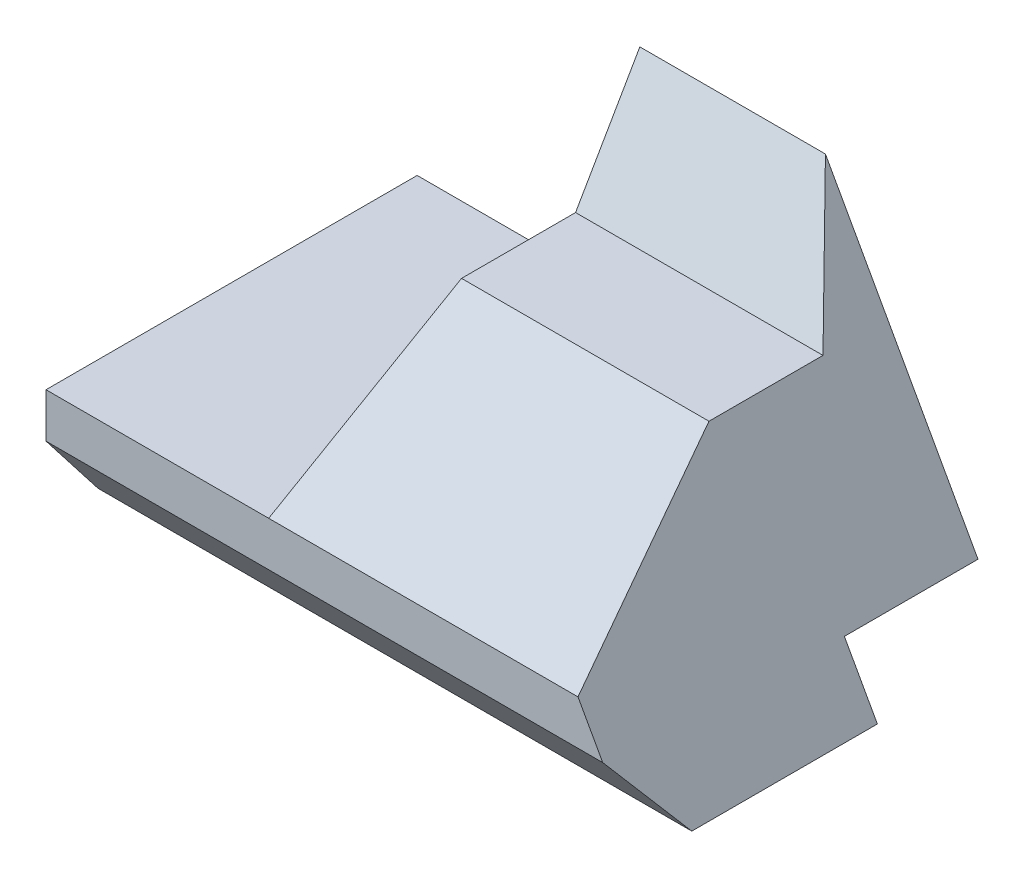
ISO-10303-21;
HEADER;
FILE_DESCRIPTION(('STEP AP214'),'2;1');
FILE_NAME('part.step','',(''),(''),'','','');
FILE_SCHEMA(('AUTOMOTIVE_DESIGN { 1 0 10303 214 1 1 1 1 }'));
ENDSEC;
DATA;
#1=APPLICATION_CONTEXT('core data for automotive mechanical design processes');
#2=APPLICATION_PROTOCOL_DEFINITION('international standard','automotive_design',2000,#1);
#3=PRODUCT_CONTEXT('',#1,'mechanical');
#4=PRODUCT('Part','Part','',(#3));
#5=PRODUCT_RELATED_PRODUCT_CATEGORY('part','',(#4));
#6=PRODUCT_DEFINITION_FORMATION('','',#4);
#7=PRODUCT_DEFINITION_CONTEXT('part definition',#1,'design');
#8=PRODUCT_DEFINITION('design','',#6,#7);
#9=PRODUCT_DEFINITION_SHAPE('','',#8);
#10=(LENGTH_UNIT() NAMED_UNIT(*) SI_UNIT(.MILLI.,.METRE.));
#11=(NAMED_UNIT(*) PLANE_ANGLE_UNIT() SI_UNIT($,.RADIAN.));
#12=(NAMED_UNIT(*) SI_UNIT($,.STERADIAN.) SOLID_ANGLE_UNIT());
#13=UNCERTAINTY_MEASURE_WITH_UNIT(LENGTH_MEASURE(1.E-05),#10,'distance_accuracy_value','');
#14=(GEOMETRIC_REPRESENTATION_CONTEXT(3) GLOBAL_UNCERTAINTY_ASSIGNED_CONTEXT((#13)) GLOBAL_UNIT_ASSIGNED_CONTEXT((#10,
#11,#12)) REPRESENTATION_CONTEXT('',''));
#15=CARTESIAN_POINT('',(0.,0.,0.));
#16=DIRECTION('',(0.,0.,1.));
#17=DIRECTION('',(1.,0.,0.));
#18=AXIS2_PLACEMENT_3D('',#15,#16,#17);
#19=CARTESIAN_POINT('',(-80.,0.999999999999993,50.));
#20=DIRECTION('',(0.,0.,1.));
#21=DIRECTION('',(0.,-1.,0.));
#22=AXIS2_PLACEMENT_3D('',#19,#20,#21);
#23=PLANE('',#22);
#24=DIRECTION('',(1.,0.,0.));
#25=VECTOR('',#24,1.);
#26=CARTESIAN_POINT('',(-80.,0.999999999999993,50.));
#27=LINE('',#26,#25);
#28=CARTESIAN_POINT('',(-80.,0.999999999999993,50.));
#29=VERTEX_POINT('',#28);
#30=CARTESIAN_POINT('',(-5.,0.999999999999994,50.));
#31=VERTEX_POINT('',#30);
#32=EDGE_CURVE('E138',#29,#31,#27,.T.);
#33=ORIENTED_EDGE('',*,*,#32,.T.);
#34=DIRECTION('',(0.485642931178632,-0.874157276121538,0.));
#35=VECTOR('',#34,1.);
#36=CARTESIAN_POINT('',(-25.,37.,50.));
#37=LINE('',#36,#35);
#38=CARTESIAN_POINT('',(-8.33333333333333,6.99999999999999,50.));
#39=VERTEX_POINT('',#38);
#40=EDGE_CURVE('E199',#39,#31,#37,.T.);
#41=ORIENTED_EDGE('',*,*,#40,.F.);
#42=DIRECTION('',(1.,0.,0.));
#43=VECTOR('',#42,1.);
#44=CARTESIAN_POINT('',(-80.,6.99999999999999,50.));
#45=LINE('',#44,#43);
#46=CARTESIAN_POINT('',(-50.,7.,50.));
#47=VERTEX_POINT('',#46);
#48=EDGE_CURVE('E146',#47,#39,#45,.T.);
#49=ORIENTED_EDGE('',*,*,#48,.F.);
#50=CARTESIAN_POINT('',(-80.,7.,50.));
#51=VERTEX_POINT('',#50);
#52=EDGE_CURVE('E142',#51,#47,#45,.T.);
#53=ORIENTED_EDGE('',*,*,#52,.F.);
#54=DIRECTION('',(0.,-1.,0.));
#55=VECTOR('',#54,1.);
#56=CARTESIAN_POINT('',(-80.,0.999999999999993,50.));
#57=LINE('',#56,#55);
#58=EDGE_CURVE('E129',#51,#29,#57,.T.);
#59=ORIENTED_EDGE('',*,*,#58,.T.);
#60=EDGE_LOOP('',(#33,#41,#49,#53,#59));
#61=FACE_BOUND('',#60,.T.);
#62=ADVANCED_FACE('F39',(#61),#23,.T.);
#63=CARTESIAN_POINT('',(-80.,6.99999999999999,50.));
#64=DIRECTION('',(0.,0.866025403784442,0.499999999999995));
#65=DIRECTION('',(0.,-0.499999999999995,0.866025403784442));
#66=AXIS2_PLACEMENT_3D('',#63,#64,#65);
#67=PLANE('',#66);
#68=ORIENTED_EDGE('',*,*,#48,.T.);
#69=DIRECTION('',(0.267643863786092,-0.481758954814966,0.834430986740811));
#70=VECTOR('',#69,1.);
#71=CARTESIAN_POINT('',(-13.3951921424459,16.1113458564026,34.2186860513782));
#72=LINE('',#71,#70);
#73=CARTESIAN_POINT('',(-16.6666666666667,22.,24.0192378864665));
#74=VERTEX_POINT('',#73);
#75=EDGE_CURVE('E202',#74,#39,#72,.T.);
#76=ORIENTED_EDGE('',*,*,#75,.F.);
#77=DIRECTION('',(1.,0.,0.));
#78=VECTOR('',#77,1.);
#79=CARTESIAN_POINT('',(-80.,22.,24.0192378864665));
#80=LINE('',#79,#78);
#81=CARTESIAN_POINT('',(-50.,22.,24.0192378864665));
#82=VERTEX_POINT('',#81);
#83=EDGE_CURVE('E147',#82,#74,#80,.T.);
#84=ORIENTED_EDGE('',*,*,#83,.F.);
#85=DIRECTION('',(0.,0.499999999999995,-0.866025403784442));
#86=VECTOR('',#85,1.);
#87=CARTESIAN_POINT('',(-50.,14.4995669872979,37.0103689432335));
#88=LINE('',#87,#86);
#89=EDGE_CURVE('E185',#47,#82,#88,.T.);
#90=ORIENTED_EDGE('',*,*,#89,.F.);
#91=EDGE_LOOP('',(#68,#76,#84,#90));
#92=FACE_BOUND('',#91,.T.);
#93=ADVANCED_FACE('F259',(#92),#67,.T.);
#94=CARTESIAN_POINT('',(-80.,22.,24.0192378864665));
#95=DIRECTION('',(0.,1.,0.));
#96=DIRECTION('',(0.,0.,1.));
#97=AXIS2_PLACEMENT_3D('',#94,#95,#96);
#98=PLANE('',#97);
#99=ORIENTED_EDGE('',*,*,#83,.T.);
#100=DIRECTION('',(0.,0.,1.));
#101=VECTOR('',#100,1.);
#102=CARTESIAN_POINT('',(-16.6666666666667,22.,50.001));
#103=LINE('',#102,#101);
#104=CARTESIAN_POINT('',(-16.6666666666667,22.,8.66025403784434));
#105=VERTEX_POINT('',#104);
#106=EDGE_CURVE('E206',#105,#74,#103,.T.);
#107=ORIENTED_EDGE('',*,*,#106,.F.);
#108=DIRECTION('',(1.,0.,0.));
#109=VECTOR('',#108,1.);
#110=CARTESIAN_POINT('',(-80.,22.,8.66025403784433));
#111=LINE('',#110,#109);
#112=CARTESIAN_POINT('',(-50.,22.,8.66025403784433));
#113=VERTEX_POINT('',#112);
#114=EDGE_CURVE('E151',#113,#105,#111,.T.);
#115=ORIENTED_EDGE('',*,*,#114,.F.);
#116=DIRECTION('',(0.,0.,-1.));
#117=VECTOR('',#116,1.);
#118=CARTESIAN_POINT('',(-50.,22.,50.001));
#119=LINE('',#118,#117);
#120=EDGE_CURVE('E189',#82,#113,#119,.T.);
#121=ORIENTED_EDGE('',*,*,#120,.F.);
#122=EDGE_LOOP('',(#99,#107,#115,#121));
#123=FACE_BOUND('',#122,.T.);
#124=ADVANCED_FACE('F256',(#123),#98,.T.);
#125=CARTESIAN_POINT('',(-80.,22.,8.66025403784433));
#126=DIRECTION('',(0.,0.499999999999998,0.86602540378444));
#127=DIRECTION('',(0.,-0.86602540378444,0.499999999999998));
#128=AXIS2_PLACEMENT_3D('',#125,#126,#127);
#129=PLANE('',#128);
#130=ORIENTED_EDGE('',*,*,#114,.T.);
#131=DIRECTION('',(0.433554984762061,-0.780398972571709,0.450563556889581));
#132=VECTOR('',#131,1.);
#133=CARTESIAN_POINT('',(-15.2326008538439,19.4186815369189,10.1505789473683));
#134=LINE('',#133,#132);
#135=CARTESIAN_POINT('',(-25.,37.,0.));
#136=VERTEX_POINT('',#135);
#137=EDGE_CURVE('E214',#136,#105,#134,.T.);
#138=ORIENTED_EDGE('',*,*,#137,.F.);
#139=DIRECTION('',(1.,0.,0.));
#140=VECTOR('',#139,1.);
#141=CARTESIAN_POINT('',(-80.,37.,0.));
#142=LINE('',#141,#140);
#143=CARTESIAN_POINT('',(-50.,37.,0.));
#144=VERTEX_POINT('',#143);
#145=EDGE_CURVE('E155',#144,#136,#142,.T.);
#146=ORIENTED_EDGE('',*,*,#145,.F.);
#147=DIRECTION('',(0.,0.86602540378444,-0.499999999999998));
#148=VECTOR('',#147,1.);
#149=CARTESIAN_POINT('',(-50.,15.3489318926872,12.5002499999999));
#150=LINE('',#149,#148);
#151=EDGE_CURVE('E193',#113,#144,#150,.T.);
#152=ORIENTED_EDGE('',*,*,#151,.F.);
#153=EDGE_LOOP('',(#130,#138,#146,#152));
#154=FACE_BOUND('',#153,.T.);
#155=ADVANCED_FACE('F277',(#154),#129,.T.);
#156=CARTESIAN_POINT('',(-80.,37.,0.));
#157=DIRECTION('',(0.,0.,-1.));
#158=DIRECTION('',(-1.,0.,0.));
#159=AXIS2_PLACEMENT_3D('',#156,#157,#158);
#160=PLANE('',#159);
#161=ORIENTED_EDGE('',*,*,#145,.T.);
#162=DIRECTION('',(0.485642931178632,-0.874157276121538,0.));
#163=VECTOR('',#162,1.);
#164=CARTESIAN_POINT('',(-25.,37.,0.));
#165=LINE('',#164,#163);
#166=CARTESIAN_POINT('',(-4.44444444444444,0.,0.));
#167=VERTEX_POINT('',#166);
#168=EDGE_CURVE('E196',#136,#167,#165,.T.);
#169=ORIENTED_EDGE('',*,*,#168,.T.);
#170=DIRECTION('',(1.,0.,0.));
#171=VECTOR('',#170,1.);
#172=CARTESIAN_POINT('',(-80.,0.,0.));
#173=LINE('',#172,#171);
#174=CARTESIAN_POINT('',(-80.,0.,0.));
#175=VERTEX_POINT('',#174);
#176=EDGE_CURVE('E63',#175,#167,#173,.T.);
#177=ORIENTED_EDGE('',*,*,#176,.F.);
#178=DIRECTION('',(0.,1.,0.));
#179=VECTOR('',#178,1.);
#180=CARTESIAN_POINT('',(-80.,37.,0.));
#181=LINE('',#180,#179);
#182=CARTESIAN_POINT('',(-80.,7.,0.));
#183=VERTEX_POINT('',#182);
#184=EDGE_CURVE('E135',#175,#183,#181,.T.);
#185=ORIENTED_EDGE('',*,*,#184,.T.);
#186=DIRECTION('',(-1.,0.,0.));
#187=VECTOR('',#186,1.);
#188=CARTESIAN_POINT('',(-80.,7.,0.));
#189=LINE('',#188,#187);
#190=CARTESIAN_POINT('',(-50.,7.,0.));
#191=VERTEX_POINT('',#190);
#192=EDGE_CURVE('E54',#191,#183,#189,.T.);
#193=ORIENTED_EDGE('',*,*,#192,.F.);
#194=DIRECTION('',(0.,-1.,0.));
#195=VECTOR('',#194,1.);
#196=CARTESIAN_POINT('',(-50.,37.,0.));
#197=LINE('',#196,#195);
#198=EDGE_CURVE('E11',#144,#191,#197,.T.);
#199=ORIENTED_EDGE('',*,*,#198,.F.);
#200=EDGE_LOOP('',(#161,#169,#177,#185,#193,#199));
#201=FACE_BOUND('',#200,.T.);
#202=ADVANCED_FACE('F231',(#201),#160,.T.);
#203=CARTESIAN_POINT('',(-80.,0.,0.));
#204=DIRECTION('',(0.,-1.,0.));
#205=DIRECTION('',(0.,0.,-1.));
#206=AXIS2_PLACEMENT_3D('',#203,#204,#205);
#207=PLANE('',#206);
#208=ORIENTED_EDGE('',*,*,#176,.T.);
#209=DIRECTION('',(0.,0.,-1.));
#210=VECTOR('',#209,1.);
#211=CARTESIAN_POINT('',(-4.44444444444444,0.,50.001));
#212=LINE('',#211,#210);
#213=CARTESIAN_POINT('',(-4.44444444444444,0.,18.));
#214=VERTEX_POINT('',#213);
#215=EDGE_CURVE('E218',#214,#167,#212,.T.);
#216=ORIENTED_EDGE('',*,*,#215,.F.);
#217=DIRECTION('',(1.,0.,0.));
#218=VECTOR('',#217,1.);
#219=CARTESIAN_POINT('',(-80.,0.,18.));
#220=LINE('',#219,#218);
#221=CARTESIAN_POINT('',(-80.,0.,18.));
#222=VERTEX_POINT('',#221);
#223=EDGE_CURVE('E110',#222,#214,#220,.T.);
#224=ORIENTED_EDGE('',*,*,#223,.F.);
#225=DIRECTION('',(0.,0.,-1.));
#226=VECTOR('',#225,1.);
#227=CARTESIAN_POINT('',(-80.,0.,0.));
#228=LINE('',#227,#226);
#229=EDGE_CURVE('E121',#222,#175,#228,.T.);
#230=ORIENTED_EDGE('',*,*,#229,.T.);
#231=EDGE_LOOP('',(#208,#216,#224,#230));
#232=FACE_BOUND('',#231,.T.);
#233=ADVANCED_FACE('F233',(#232),#207,.T.);
#234=CARTESIAN_POINT('',(-80.,0.,18.));
#235=DIRECTION('',(0.,0.,-1.));
#236=DIRECTION('',(-1.,0.,0.));
#237=AXIS2_PLACEMENT_3D('',#234,#235,#236);
#238=PLANE('',#237);
#239=ORIENTED_EDGE('',*,*,#223,.T.);
#240=DIRECTION('',(-0.485642931178632,0.874157276121538,0.));
#241=VECTOR('',#240,1.);
#242=CARTESIAN_POINT('',(-25.,37.,18.));
#243=LINE('',#242,#241);
#244=CARTESIAN_POINT('',(0.,-8.,18.));
#245=VERTEX_POINT('',#244);
#246=EDGE_CURVE('E105',#245,#214,#243,.T.);
#247=ORIENTED_EDGE('',*,*,#246,.F.);
#248=DIRECTION('',(1.,0.,0.));
#249=VECTOR('',#248,1.);
#250=CARTESIAN_POINT('',(-80.,-8.,18.));
#251=LINE('',#250,#249);
#252=CARTESIAN_POINT('',(-80.,-8.,18.));
#253=VERTEX_POINT('',#252);
#254=EDGE_CURVE('E98',#253,#245,#251,.T.);
#255=ORIENTED_EDGE('',*,*,#254,.F.);
#256=DIRECTION('',(0.,1.,0.));
#257=VECTOR('',#256,1.);
#258=CARTESIAN_POINT('',(-80.,0.,18.));
#259=LINE('',#258,#257);
#260=EDGE_CURVE('E102',#253,#222,#259,.T.);
#261=ORIENTED_EDGE('',*,*,#260,.T.);
#262=EDGE_LOOP('',(#239,#247,#255,#261));
#263=FACE_BOUND('',#262,.T.);
#264=ADVANCED_FACE('F101',(#263),#238,.T.);
#265=CARTESIAN_POINT('',(-80.,-8.00000000000001,43.));
#266=DIRECTION('',(0.,-0.61394061351492,0.789352217376327));
#267=DIRECTION('',(0.,-0.789352217376327,-0.61394061351492));
#268=AXIS2_PLACEMENT_3D('',#265,#266,#267);
#269=PLANE('',#268);
#270=DIRECTION('',(1.,0.,0.));
#271=VECTOR('',#270,1.);
#272=CARTESIAN_POINT('',(-80.,-8.00000000000001,43.));
#273=LINE('',#272,#271);
#274=CARTESIAN_POINT('',(-80.,-8.00000000000001,43.));
#275=VERTEX_POINT('',#274);
#276=CARTESIAN_POINT('',(0.,-8.00000000000001,43.));
#277=VERTEX_POINT('',#276);
#278=EDGE_CURVE('E111',#275,#277,#273,.T.);
#279=ORIENTED_EDGE('',*,*,#278,.T.);
#280=DIRECTION('',(0.40160966445125,-0.722897396012249,-0.562253530231749));
#281=VECTOR('',#280,1.);
#282=CARTESIAN_POINT('',(-18.6776451612903,25.6197612903226,69.1487032258064));
#283=LINE('',#282,#281);
#284=EDGE_CURVE('E77',#31,#277,#283,.T.);
#285=ORIENTED_EDGE('',*,*,#284,.F.);
#286=ORIENTED_EDGE('',*,*,#32,.F.);
#287=DIRECTION('',(0.,-0.789352217376327,-0.61394061351492));
#288=VECTOR('',#287,1.);
#289=CARTESIAN_POINT('',(-80.,-8.00000000000001,43.));
#290=LINE('',#289,#288);
#291=EDGE_CURVE('E126',#29,#275,#290,.T.);
#292=ORIENTED_EDGE('',*,*,#291,.T.);
#293=EDGE_LOOP('',(#279,#285,#286,#292));
#294=FACE_BOUND('',#293,.T.);
#295=ADVANCED_FACE('F261',(#294),#269,.T.);
#296=CARTESIAN_POINT('',(-80.,-8.,18.));
#297=DIRECTION('',(0.,-1.,0.));
#298=DIRECTION('',(0.,0.,-1.));
#299=AXIS2_PLACEMENT_3D('',#296,#297,#298);
#300=PLANE('',#299);
#301=DIRECTION('',(0.,0.,-1.));
#302=VECTOR('',#301,1.);
#303=CARTESIAN_POINT('',(0.,-8.,18.));
#304=LINE('',#303,#302);
#305=EDGE_CURVE('E139',#277,#245,#304,.T.);
#306=ORIENTED_EDGE('',*,*,#305,.F.);
#307=ORIENTED_EDGE('',*,*,#278,.F.);
#308=DIRECTION('',(0.,0.,-1.));
#309=VECTOR('',#308,1.);
#310=CARTESIAN_POINT('',(-80.,-8.,18.));
#311=LINE('',#310,#309);
#312=EDGE_CURVE('E118',#275,#253,#311,.T.);
#313=ORIENTED_EDGE('',*,*,#312,.T.);
#314=ORIENTED_EDGE('',*,*,#254,.T.);
#315=EDGE_LOOP('',(#306,#307,#313,#314));
#316=FACE_BOUND('',#315,.T.);
#317=ADVANCED_FACE('F124',(#316),#300,.T.);
#318=CARTESIAN_POINT('',(-80.,0.,0.));
#319=DIRECTION('',(-1.,0.,0.));
#320=DIRECTION('',(0.,0.,1.));
#321=AXIS2_PLACEMENT_3D('',#318,#319,#320);
#322=PLANE('',#321);
#323=DIRECTION('',(0.,0.,1.));
#324=VECTOR('',#323,1.);
#325=CARTESIAN_POINT('',(-80.,7.,0.));
#326=LINE('',#325,#324);
#327=EDGE_CURVE('E47',#183,#51,#326,.T.);
#328=ORIENTED_EDGE('',*,*,#327,.F.);
#329=ORIENTED_EDGE('',*,*,#184,.F.);
#330=ORIENTED_EDGE('',*,*,#229,.F.);
#331=ORIENTED_EDGE('',*,*,#260,.F.);
#332=ORIENTED_EDGE('',*,*,#312,.F.);
#333=ORIENTED_EDGE('',*,*,#291,.F.);
#334=ORIENTED_EDGE('',*,*,#58,.F.);
#335=EDGE_LOOP('',(#328,#329,#330,#331,#332,#333,#334));
#336=FACE_BOUND('',#335,.T.);
#337=ADVANCED_FACE('F116',(#336),#322,.T.);
#338=CARTESIAN_POINT('',(-50.,37.,-1.2E-05));
#339=DIRECTION('',(1.,0.,0.));
#340=DIRECTION('',(0.,1.,0.));
#341=AXIS2_PLACEMENT_3D('',#338,#339,#340);
#342=PLANE('',#341);
#343=ORIENTED_EDGE('',*,*,#198,.T.);
#344=DIRECTION('',(0.,0.,1.));
#345=VECTOR('',#344,1.);
#346=CARTESIAN_POINT('',(-50.,7.,-1.2E-05));
#347=LINE('',#346,#345);
#348=EDGE_CURVE('E182',#191,#47,#347,.T.);
#349=ORIENTED_EDGE('',*,*,#348,.T.);
#350=ORIENTED_EDGE('',*,*,#89,.T.);
#351=ORIENTED_EDGE('',*,*,#120,.T.);
#352=ORIENTED_EDGE('',*,*,#151,.T.);
#353=EDGE_LOOP('',(#343,#349,#350,#351,#352));
#354=FACE_BOUND('',#353,.T.);
#355=ADVANCED_FACE('F250',(#354),#342,.F.);
#356=CARTESIAN_POINT('',(-50.,7.,-1.2E-05));
#357=DIRECTION('',(0.,-1.,0.));
#358=DIRECTION('',(1.,0.,0.));
#359=AXIS2_PLACEMENT_3D('',#356,#357,#358);
#360=PLANE('',#359);
#361=ORIENTED_EDGE('',*,*,#192,.T.);
#362=ORIENTED_EDGE('',*,*,#327,.T.);
#363=ORIENTED_EDGE('',*,*,#52,.T.);
#364=ORIENTED_EDGE('',*,*,#348,.F.);
#365=EDGE_LOOP('',(#361,#362,#363,#364));
#366=FACE_BOUND('',#365,.T.);
#367=ADVANCED_FACE('F169',(#366),#360,.F.);
#368=CARTESIAN_POINT('',(-25.,37.,50.001));
#369=DIRECTION('',(0.874157276121538,0.485642931178632,0.));
#370=DIRECTION('',(-0.485642931178632,0.874157276121538,0.));
#371=AXIS2_PLACEMENT_3D('',#368,#369,#370);
#372=PLANE('',#371);
#373=ORIENTED_EDGE('',*,*,#215,.T.);
#374=ORIENTED_EDGE('',*,*,#168,.F.);
#375=ORIENTED_EDGE('',*,*,#137,.T.);
#376=ORIENTED_EDGE('',*,*,#106,.T.);
#377=ORIENTED_EDGE('',*,*,#75,.T.);
#378=ORIENTED_EDGE('',*,*,#40,.T.);
#379=ORIENTED_EDGE('',*,*,#284,.T.);
#380=ORIENTED_EDGE('',*,*,#305,.T.);
#381=ORIENTED_EDGE('',*,*,#246,.T.);
#382=EDGE_LOOP('',(#373,#374,#375,#376,#377,#378,#379,#380,#381));
#383=FACE_BOUND('',#382,.T.);
#384=ADVANCED_FACE('F224',(#383),#372,.T.);
#385=CLOSED_SHELL('',(#62,#93,#124,#155,#202,#233,#264,#295,#317,#337,#355,#367,#384));
#386=MANIFOLD_SOLID_BREP('B2',#385);
#387=ADVANCED_BREP_SHAPE_REPRESENTATION('',(#18,#386),#14);
#388=SHAPE_DEFINITION_REPRESENTATION(#9,#387);
ENDSEC;
END-ISO-10303-21;
